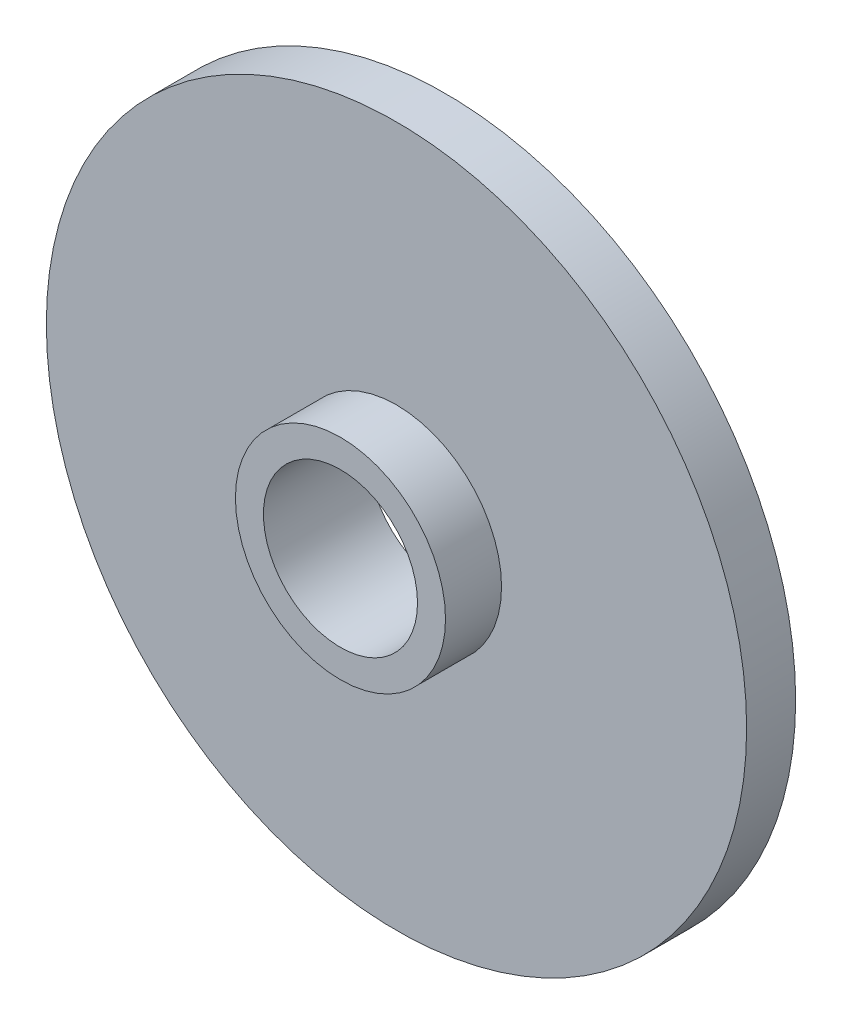
ISO-10303-21;
HEADER;
FILE_DESCRIPTION(('STEP AP214'),'2;1');
FILE_NAME('part.step','',(''),(''),'','','');
FILE_SCHEMA(('AUTOMOTIVE_DESIGN { 1 0 10303 214 1 1 1 1 }'));
ENDSEC;
DATA;
#1=APPLICATION_CONTEXT('core data for automotive mechanical design processes');
#2=APPLICATION_PROTOCOL_DEFINITION('international standard','automotive_design',2000,#1);
#3=PRODUCT_CONTEXT('',#1,'mechanical');
#4=PRODUCT('Part','Part','',(#3));
#5=PRODUCT_RELATED_PRODUCT_CATEGORY('part','',(#4));
#6=PRODUCT_DEFINITION_FORMATION('','',#4);
#7=PRODUCT_DEFINITION_CONTEXT('part definition',#1,'design');
#8=PRODUCT_DEFINITION('design','',#6,#7);
#9=PRODUCT_DEFINITION_SHAPE('','',#8);
#10=(LENGTH_UNIT() NAMED_UNIT(*) SI_UNIT(.MILLI.,.METRE.));
#11=(NAMED_UNIT(*) PLANE_ANGLE_UNIT() SI_UNIT($,.RADIAN.));
#12=(NAMED_UNIT(*) SI_UNIT($,.STERADIAN.) SOLID_ANGLE_UNIT());
#13=UNCERTAINTY_MEASURE_WITH_UNIT(LENGTH_MEASURE(1.E-05),#10,'distance_accuracy_value','');
#14=(GEOMETRIC_REPRESENTATION_CONTEXT(3) GLOBAL_UNCERTAINTY_ASSIGNED_CONTEXT((#13)) GLOBAL_UNIT_ASSIGNED_CONTEXT((#10,
#11,#12)) REPRESENTATION_CONTEXT('',''));
#15=CARTESIAN_POINT('',(0.,0.,0.));
#16=DIRECTION('',(0.,0.,1.));
#17=DIRECTION('',(1.,0.,0.));
#18=AXIS2_PLACEMENT_3D('',#15,#16,#17);
#19=CARTESIAN_POINT('',(0.,0.,7.));
#20=DIRECTION('',(0.,0.,-1.));
#21=DIRECTION('',(-1.,0.,0.));
#22=AXIS2_PLACEMENT_3D('',#19,#20,#21);
#23=CYLINDRICAL_SURFACE('',#22,50.);
#24=CARTESIAN_POINT('',(0.,0.,7.));
#25=DIRECTION('',(0.,0.,1.));
#26=DIRECTION('',(1.,0.,0.));
#27=AXIS2_PLACEMENT_3D('',#24,#25,#26);
#28=CIRCLE('',#27,50.);
#29=CARTESIAN_POINT('',(50.,0.,7.));
#30=VERTEX_POINT('',#29);
#31=EDGE_CURVE('E45',#30,#30,#28,.T.);
#32=ORIENTED_EDGE('',*,*,#31,.F.);
#33=EDGE_LOOP('',(#32));
#34=FACE_BOUND('',#33,.T.);
#35=CARTESIAN_POINT('',(0.,0.,0.));
#36=DIRECTION('',(0.,0.,1.));
#37=DIRECTION('',(1.,0.,0.));
#38=AXIS2_PLACEMENT_3D('',#35,#36,#37);
#39=CIRCLE('',#38,50.);
#40=CARTESIAN_POINT('',(50.,0.,0.));
#41=VERTEX_POINT('',#40);
#42=EDGE_CURVE('E40',#41,#41,#39,.T.);
#43=ORIENTED_EDGE('',*,*,#42,.T.);
#44=EDGE_LOOP('',(#43));
#45=FACE_BOUND('',#44,.T.);
#46=ADVANCED_FACE('F37',(#34,#45),#23,.T.);
#47=CARTESIAN_POINT('',(0.,0.,7.));
#48=DIRECTION('',(0.,0.,1.));
#49=DIRECTION('',(1.,0.,0.));
#50=AXIS2_PLACEMENT_3D('',#47,#48,#49);
#51=PLANE('',#50);
#52=CARTESIAN_POINT('',(0.,0.,7.));
#53=DIRECTION('',(0.,0.,1.));
#54=DIRECTION('',(1.,0.,0.));
#55=AXIS2_PLACEMENT_3D('',#52,#53,#54);
#56=CIRCLE('',#55,15.);
#57=CARTESIAN_POINT('',(15.,0.,7.));
#58=VERTEX_POINT('',#57);
#59=EDGE_CURVE('E10',#58,#58,#56,.T.);
#60=ORIENTED_EDGE('',*,*,#59,.F.);
#61=EDGE_LOOP('',(#60));
#62=FACE_BOUND('',#61,.T.);
#63=ORIENTED_EDGE('',*,*,#31,.T.);
#64=EDGE_LOOP('',(#63));
#65=FACE_BOUND('',#64,.T.);
#66=ADVANCED_FACE('F86',(#62,#65),#51,.T.);
#67=CARTESIAN_POINT('',(0.,0.,0.));
#68=DIRECTION('',(0.,0.,1.));
#69=DIRECTION('',(1.,0.,0.));
#70=AXIS2_PLACEMENT_3D('',#67,#68,#69);
#71=PLANE('',#70);
#72=CARTESIAN_POINT('',(0.,0.,0.));
#73=DIRECTION('',(0.,0.,1.));
#74=DIRECTION('',(1.,0.,0.));
#75=AXIS2_PLACEMENT_3D('',#72,#73,#74);
#76=CIRCLE('',#75,11.);
#77=CARTESIAN_POINT('',(11.,0.,0.));
#78=VERTEX_POINT('',#77);
#79=EDGE_CURVE('E56',#78,#78,#76,.T.);
#80=ORIENTED_EDGE('',*,*,#79,.T.);
#81=EDGE_LOOP('',(#80));
#82=FACE_BOUND('',#81,.T.);
#83=ORIENTED_EDGE('',*,*,#42,.F.);
#84=EDGE_LOOP('',(#83));
#85=FACE_BOUND('',#84,.T.);
#86=ADVANCED_FACE('F65',(#82,#85),#71,.F.);
#87=CARTESIAN_POINT('',(0.,0.,15.));
#88=DIRECTION('',(0.,0.,-1.));
#89=DIRECTION('',(-1.,0.,0.));
#90=AXIS2_PLACEMENT_3D('',#87,#88,#89);
#91=CYLINDRICAL_SURFACE('',#90,15.);
#92=CARTESIAN_POINT('',(0.,0.,15.));
#93=DIRECTION('',(0.,0.,1.));
#94=DIRECTION('',(1.,0.,0.));
#95=AXIS2_PLACEMENT_3D('',#92,#93,#94);
#96=CIRCLE('',#95,15.);
#97=CARTESIAN_POINT('',(15.,0.,15.));
#98=VERTEX_POINT('',#97);
#99=EDGE_CURVE('E52',#98,#98,#96,.T.);
#100=ORIENTED_EDGE('',*,*,#99,.F.);
#101=EDGE_LOOP('',(#100));
#102=FACE_BOUND('',#101,.T.);
#103=ORIENTED_EDGE('',*,*,#59,.T.);
#104=EDGE_LOOP('',(#103));
#105=FACE_BOUND('',#104,.T.);
#106=ADVANCED_FACE('F77',(#102,#105),#91,.T.);
#107=CARTESIAN_POINT('',(0.,0.,15.));
#108=DIRECTION('',(0.,0.,1.));
#109=DIRECTION('',(1.,0.,0.));
#110=AXIS2_PLACEMENT_3D('',#107,#108,#109);
#111=PLANE('',#110);
#112=CARTESIAN_POINT('',(0.,0.,15.));
#113=DIRECTION('',(0.,0.,1.));
#114=DIRECTION('',(1.,0.,0.));
#115=AXIS2_PLACEMENT_3D('',#112,#113,#114);
#116=CIRCLE('',#115,11.);
#117=CARTESIAN_POINT('',(11.,0.,15.));
#118=VERTEX_POINT('',#117);
#119=EDGE_CURVE('E57',#118,#118,#116,.T.);
#120=ORIENTED_EDGE('',*,*,#119,.F.);
#121=EDGE_LOOP('',(#120));
#122=FACE_BOUND('',#121,.T.);
#123=ORIENTED_EDGE('',*,*,#99,.T.);
#124=EDGE_LOOP('',(#123));
#125=FACE_BOUND('',#124,.T.);
#126=ADVANCED_FACE('F71',(#122,#125),#111,.T.);
#127=CARTESIAN_POINT('',(0.,0.,0.));
#128=DIRECTION('',(0.,0.,1.));
#129=DIRECTION('',(1.,0.,0.));
#130=AXIS2_PLACEMENT_3D('',#127,#128,#129);
#131=CYLINDRICAL_SURFACE('',#130,11.);
#132=ORIENTED_EDGE('',*,*,#79,.F.);
#133=EDGE_LOOP('',(#132));
#134=FACE_BOUND('',#133,.T.);
#135=ORIENTED_EDGE('',*,*,#119,.T.);
#136=EDGE_LOOP('',(#135));
#137=FACE_BOUND('',#136,.T.);
#138=ADVANCED_FACE('F68',(#134,#137),#131,.F.);
#139=CLOSED_SHELL('',(#46,#66,#86,#106,#126,#138));
#140=MANIFOLD_SOLID_BREP('B2',#139);
#141=ADVANCED_BREP_SHAPE_REPRESENTATION('',(#18,#140),#14);
#142=SHAPE_DEFINITION_REPRESENTATION(#9,#141);
ENDSEC;
END-ISO-10303-21;
